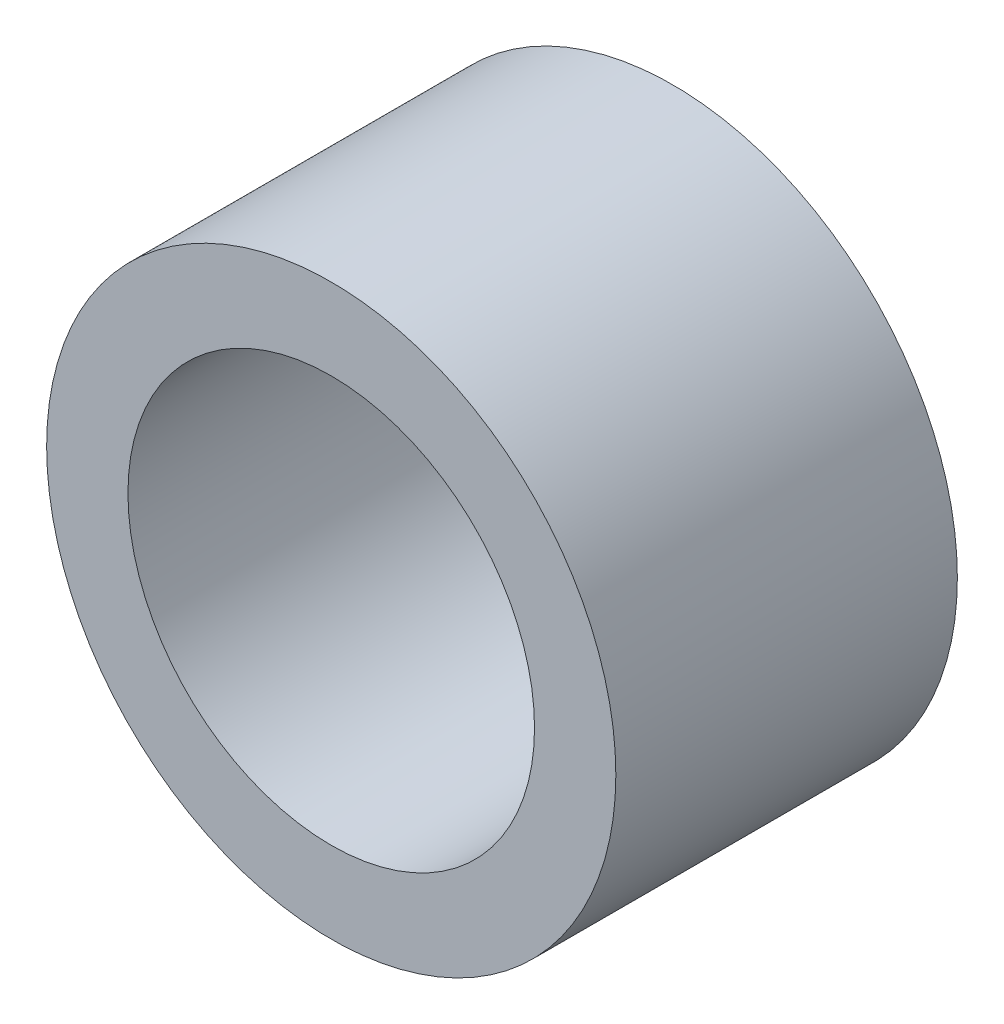
ISO-10303-21;
HEADER;
FILE_DESCRIPTION(('STEP AP214'),'2;1');
FILE_NAME('part.step','',(''),(''),'','','');
FILE_SCHEMA(('AUTOMOTIVE_DESIGN { 1 0 10303 214 1 1 1 1 }'));
ENDSEC;
DATA;
#1=APPLICATION_CONTEXT('core data for automotive mechanical design processes');
#2=APPLICATION_PROTOCOL_DEFINITION('international standard','automotive_design',2000,#1);
#3=PRODUCT_CONTEXT('',#1,'mechanical');
#4=PRODUCT('Part','Part','',(#3));
#5=PRODUCT_RELATED_PRODUCT_CATEGORY('part','',(#4));
#6=PRODUCT_DEFINITION_FORMATION('','',#4);
#7=PRODUCT_DEFINITION_CONTEXT('part definition',#1,'design');
#8=PRODUCT_DEFINITION('design','',#6,#7);
#9=PRODUCT_DEFINITION_SHAPE('','',#8);
#10=(LENGTH_UNIT() NAMED_UNIT(*) SI_UNIT(.MILLI.,.METRE.));
#11=(NAMED_UNIT(*) PLANE_ANGLE_UNIT() SI_UNIT($,.RADIAN.));
#12=(NAMED_UNIT(*) SI_UNIT($,.STERADIAN.) SOLID_ANGLE_UNIT());
#13=UNCERTAINTY_MEASURE_WITH_UNIT(LENGTH_MEASURE(1.E-05),#10,'distance_accuracy_value','');
#14=(GEOMETRIC_REPRESENTATION_CONTEXT(3) GLOBAL_UNCERTAINTY_ASSIGNED_CONTEXT((#13)) GLOBAL_UNIT_ASSIGNED_CONTEXT((#10,
#11,#12)) REPRESENTATION_CONTEXT('',''));
#15=CARTESIAN_POINT('',(0.,0.,0.));
#16=DIRECTION('',(0.,0.,1.));
#17=DIRECTION('',(1.,0.,0.));
#18=AXIS2_PLACEMENT_3D('',#15,#16,#17);
#19=CARTESIAN_POINT('',(0.,0.,21.));
#20=DIRECTION('',(0.,0.,1.));
#21=DIRECTION('',(1.,0.,0.));
#22=AXIS2_PLACEMENT_3D('',#19,#20,#21);
#23=PLANE('',#22);
#24=CARTESIAN_POINT('',(0.,0.,21.));
#25=DIRECTION('',(0.,0.,1.));
#26=DIRECTION('',(1.,0.,0.));
#27=AXIS2_PLACEMENT_3D('',#24,#25,#26);
#28=CIRCLE('',#27,17.5);
#29=CARTESIAN_POINT('',(-17.5,0.,21.));
#30=VERTEX_POINT('',#29);
#31=EDGE_CURVE('E10',#30,#30,#28,.T.);
#32=ORIENTED_EDGE('',*,*,#31,.T.);
#33=EDGE_LOOP('',(#32));
#34=FACE_BOUND('',#33,.T.);
#35=CARTESIAN_POINT('',(0.,0.,21.));
#36=DIRECTION('',(0.,0.,1.));
#37=DIRECTION('',(1.,0.,0.));
#38=AXIS2_PLACEMENT_3D('',#35,#36,#37);
#39=CIRCLE('',#38,12.5);
#40=CARTESIAN_POINT('',(-12.5,0.,21.));
#41=VERTEX_POINT('',#40);
#42=EDGE_CURVE('E56',#41,#41,#39,.T.);
#43=ORIENTED_EDGE('',*,*,#42,.F.);
#44=EDGE_LOOP('',(#43));
#45=FACE_BOUND('',#44,.T.);
#46=ADVANCED_FACE('F43',(#34,#45),#23,.T.);
#47=CARTESIAN_POINT('',(0.,0.,0.));
#48=DIRECTION('',(0.,0.,1.));
#49=DIRECTION('',(1.,0.,0.));
#50=AXIS2_PLACEMENT_3D('',#47,#48,#49);
#51=PLANE('',#50);
#52=CARTESIAN_POINT('',(0.,0.,0.));
#53=DIRECTION('',(0.,0.,1.));
#54=DIRECTION('',(1.,0.,0.));
#55=AXIS2_PLACEMENT_3D('',#52,#53,#54);
#56=CIRCLE('',#55,17.5);
#57=CARTESIAN_POINT('',(-17.5,0.,0.));
#58=VERTEX_POINT('',#57);
#59=EDGE_CURVE('E47',#58,#58,#56,.T.);
#60=ORIENTED_EDGE('',*,*,#59,.F.);
#61=EDGE_LOOP('',(#60));
#62=FACE_BOUND('',#61,.T.);
#63=CARTESIAN_POINT('',(0.,0.,0.));
#64=DIRECTION('',(0.,0.,1.));
#65=DIRECTION('',(1.,0.,0.));
#66=AXIS2_PLACEMENT_3D('',#63,#64,#65);
#67=CIRCLE('',#66,12.5);
#68=CARTESIAN_POINT('',(-12.5,0.,0.));
#69=VERTEX_POINT('',#68);
#70=EDGE_CURVE('E58',#69,#69,#67,.T.);
#71=ORIENTED_EDGE('',*,*,#70,.T.);
#72=EDGE_LOOP('',(#71));
#73=FACE_BOUND('',#72,.T.);
#74=ADVANCED_FACE('F70',(#62,#73),#51,.F.);
#75=CARTESIAN_POINT('',(0.,0.,21.));
#76=DIRECTION('',(0.,0.,-1.));
#77=DIRECTION('',(-1.,0.,0.));
#78=AXIS2_PLACEMENT_3D('',#75,#76,#77);
#79=CYLINDRICAL_SURFACE('',#78,17.5);
#80=CARTESIAN_POINT('',(-17.5,0.,21.));
#81=CARTESIAN_POINT('',(-17.5,0.,20.78125));
#82=CARTESIAN_POINT('',(-17.5,0.,20.5625));
#83=CARTESIAN_POINT('',(-17.5,0.,20.125));
#84=CARTESIAN_POINT('',(-17.5,0.,19.90625));
#85=CARTESIAN_POINT('',(-17.5,0.,19.46875));
#86=CARTESIAN_POINT('',(-17.5,0.,19.25));
#87=CARTESIAN_POINT('',(-17.5,0.,18.8125));
#88=CARTESIAN_POINT('',(-17.5,0.,18.59375));
#89=CARTESIAN_POINT('',(-17.5,0.,18.15625));
#90=CARTESIAN_POINT('',(-17.5,0.,17.9375));
#91=CARTESIAN_POINT('',(-17.5,0.,17.5));
#92=CARTESIAN_POINT('',(-17.5,0.,17.28125));
#93=CARTESIAN_POINT('',(-17.5,0.,16.84375));
#94=CARTESIAN_POINT('',(-17.5,0.,16.625));
#95=CARTESIAN_POINT('',(-17.5,0.,16.1875));
#96=CARTESIAN_POINT('',(-17.5,0.,15.96875));
#97=CARTESIAN_POINT('',(-17.5,0.,15.53125));
#98=CARTESIAN_POINT('',(-17.5,0.,15.3125));
#99=CARTESIAN_POINT('',(-17.5,0.,14.875));
#100=CARTESIAN_POINT('',(-17.5,0.,14.65625));
#101=CARTESIAN_POINT('',(-17.5,0.,14.21875));
#102=CARTESIAN_POINT('',(-17.5,0.,14.));
#103=CARTESIAN_POINT('',(-17.5,0.,13.5625));
#104=CARTESIAN_POINT('',(-17.5,0.,13.34375));
#105=CARTESIAN_POINT('',(-17.5,0.,12.90625));
#106=CARTESIAN_POINT('',(-17.5,0.,12.6875));
#107=CARTESIAN_POINT('',(-17.5,0.,12.25));
#108=CARTESIAN_POINT('',(-17.5,0.,12.03125));
#109=CARTESIAN_POINT('',(-17.5,0.,11.59375));
#110=CARTESIAN_POINT('',(-17.5,0.,11.375));
#111=CARTESIAN_POINT('',(-17.5,0.,10.9375));
#112=CARTESIAN_POINT('',(-17.5,0.,10.71875));
#113=CARTESIAN_POINT('',(-17.5,0.,10.28125));
#114=CARTESIAN_POINT('',(-17.5,0.,10.0625));
#115=CARTESIAN_POINT('',(-17.5,0.,9.625));
#116=CARTESIAN_POINT('',(-17.5,0.,9.40625));
#117=CARTESIAN_POINT('',(-17.5,0.,8.96875));
#118=CARTESIAN_POINT('',(-17.5,0.,8.75));
#119=CARTESIAN_POINT('',(-17.5,0.,8.3125));
#120=CARTESIAN_POINT('',(-17.5,0.,8.09375));
#121=CARTESIAN_POINT('',(-17.5,0.,7.65625));
#122=CARTESIAN_POINT('',(-17.5,0.,7.4375));
#123=CARTESIAN_POINT('',(-17.5,0.,7.));
#124=CARTESIAN_POINT('',(-17.5,0.,6.78125));
#125=CARTESIAN_POINT('',(-17.5,0.,6.34375));
#126=CARTESIAN_POINT('',(-17.5,0.,6.125));
#127=CARTESIAN_POINT('',(-17.5,0.,5.6875));
#128=CARTESIAN_POINT('',(-17.5,0.,5.46875));
#129=CARTESIAN_POINT('',(-17.5,0.,5.03125));
#130=CARTESIAN_POINT('',(-17.5,0.,4.8125));
#131=CARTESIAN_POINT('',(-17.5,0.,4.375));
#132=CARTESIAN_POINT('',(-17.5,0.,4.15625));
#133=CARTESIAN_POINT('',(-17.5,0.,3.71875));
#134=CARTESIAN_POINT('',(-17.5,0.,3.5));
#135=CARTESIAN_POINT('',(-17.5,0.,3.0625));
#136=CARTESIAN_POINT('',(-17.5,0.,2.84375));
#137=CARTESIAN_POINT('',(-17.5,0.,2.40625));
#138=CARTESIAN_POINT('',(-17.5,0.,2.1875));
#139=CARTESIAN_POINT('',(-17.5,0.,1.75));
#140=CARTESIAN_POINT('',(-17.5,0.,1.53125));
#141=CARTESIAN_POINT('',(-17.5,0.,1.09375));
#142=CARTESIAN_POINT('',(-17.5,0.,0.875000000000001));
#143=CARTESIAN_POINT('',(-17.5,0.,0.4375));
#144=CARTESIAN_POINT('',(-17.5,0.,0.21875));
#145=CARTESIAN_POINT('',(-17.5,0.,0.));
#146=B_SPLINE_CURVE_WITH_KNOTS('',3,(#80,#81,#82,#83,#84,#85,#86,#87,#88,#89,#90,#91,#92,#93,
#94,#95,#96,#97,#98,#99,#100,#101,#102,#103,#104,#105,#106,#107,#108,#109,#110,#111,#112,#113,
#114,#115,#116,#117,#118,#119,#120,#121,#122,#123,#124,#125,#126,#127,#128,#129,#130,#131,#132,
#133,#134,#135,#136,#137,#138,#139,#140,#141,#142,#143,#144,#145),.UNSPECIFIED.,.F.,.F.,(4,2,2,
2,2,2,2,2,2,2,2,2,2,2,2,2,2,2,2,2,2,2,2,2,2,2,2,2,2,2,2,2,4),(0.,0.656249999999997,1.3125,
1.96875,2.625,3.28125,3.9375,4.59375,5.25,5.90625,6.5625,7.21875,7.875,8.53125,9.1875,9.84375,
10.5,11.15625,11.8125,12.46875,13.125,13.78125,14.4375,15.09375,15.75,16.40625,17.0625,17.71875,
18.375,19.03125,19.6875,20.34375,21.),.UNSPECIFIED.);
#147=EDGE_CURVE('BSEAM45',#30,#58,#146,.T.);
#148=ORIENTED_EDGE('',*,*,#31,.F.);
#149=ORIENTED_EDGE('',*,*,#59,.T.);
#150=ORIENTED_EDGE('',*,*,#147,.T.);
#151=ORIENTED_EDGE('',*,*,#147,.F.);
#152=EDGE_LOOP('',(#148,#150,#149,#151));
#153=FACE_BOUND('',#152,.T.);
#154=ADVANCED_FACE('F45',(#153),#79,.T.);
#155=CARTESIAN_POINT('',(0.,0.,21.));
#156=DIRECTION('',(0.,0.,-1.));
#157=DIRECTION('',(-1.,0.,0.));
#158=AXIS2_PLACEMENT_3D('',#155,#156,#157);
#159=CYLINDRICAL_SURFACE('',#158,12.5);
#160=CARTESIAN_POINT('',(-12.5,0.,21.));
#161=CARTESIAN_POINT('',(-12.5,0.,20.78125));
#162=CARTESIAN_POINT('',(-12.5,0.,20.5625));
#163=CARTESIAN_POINT('',(-12.5,0.,20.125));
#164=CARTESIAN_POINT('',(-12.5,0.,19.90625));
#165=CARTESIAN_POINT('',(-12.5,0.,19.46875));
#166=CARTESIAN_POINT('',(-12.5,0.,19.25));
#167=CARTESIAN_POINT('',(-12.5,0.,18.8125));
#168=CARTESIAN_POINT('',(-12.5,0.,18.59375));
#169=CARTESIAN_POINT('',(-12.5,0.,18.15625));
#170=CARTESIAN_POINT('',(-12.5,0.,17.9375));
#171=CARTESIAN_POINT('',(-12.5,0.,17.5));
#172=CARTESIAN_POINT('',(-12.5,0.,17.28125));
#173=CARTESIAN_POINT('',(-12.5,0.,16.84375));
#174=CARTESIAN_POINT('',(-12.5,0.,16.625));
#175=CARTESIAN_POINT('',(-12.5,0.,16.1875));
#176=CARTESIAN_POINT('',(-12.5,0.,15.96875));
#177=CARTESIAN_POINT('',(-12.5,0.,15.53125));
#178=CARTESIAN_POINT('',(-12.5,0.,15.3125));
#179=CARTESIAN_POINT('',(-12.5,0.,14.875));
#180=CARTESIAN_POINT('',(-12.5,0.,14.65625));
#181=CARTESIAN_POINT('',(-12.5,0.,14.21875));
#182=CARTESIAN_POINT('',(-12.5,0.,14.));
#183=CARTESIAN_POINT('',(-12.5,0.,13.5625));
#184=CARTESIAN_POINT('',(-12.5,0.,13.34375));
#185=CARTESIAN_POINT('',(-12.5,0.,12.90625));
#186=CARTESIAN_POINT('',(-12.5,0.,12.6875));
#187=CARTESIAN_POINT('',(-12.5,0.,12.25));
#188=CARTESIAN_POINT('',(-12.5,0.,12.03125));
#189=CARTESIAN_POINT('',(-12.5,0.,11.59375));
#190=CARTESIAN_POINT('',(-12.5,0.,11.375));
#191=CARTESIAN_POINT('',(-12.5,0.,10.9375));
#192=CARTESIAN_POINT('',(-12.5,0.,10.71875));
#193=CARTESIAN_POINT('',(-12.5,0.,10.28125));
#194=CARTESIAN_POINT('',(-12.5,0.,10.0625));
#195=CARTESIAN_POINT('',(-12.5,0.,9.625));
#196=CARTESIAN_POINT('',(-12.5,0.,9.40625));
#197=CARTESIAN_POINT('',(-12.5,0.,8.96875));
#198=CARTESIAN_POINT('',(-12.5,0.,8.75));
#199=CARTESIAN_POINT('',(-12.5,0.,8.3125));
#200=CARTESIAN_POINT('',(-12.5,0.,8.09375));
#201=CARTESIAN_POINT('',(-12.5,0.,7.65625));
#202=CARTESIAN_POINT('',(-12.5,0.,7.4375));
#203=CARTESIAN_POINT('',(-12.5,0.,7.));
#204=CARTESIAN_POINT('',(-12.5,0.,6.78125));
#205=CARTESIAN_POINT('',(-12.5,0.,6.34375));
#206=CARTESIAN_POINT('',(-12.5,0.,6.125));
#207=CARTESIAN_POINT('',(-12.5,0.,5.6875));
#208=CARTESIAN_POINT('',(-12.5,0.,5.46875));
#209=CARTESIAN_POINT('',(-12.5,0.,5.03125));
#210=CARTESIAN_POINT('',(-12.5,0.,4.8125));
#211=CARTESIAN_POINT('',(-12.5,0.,4.375));
#212=CARTESIAN_POINT('',(-12.5,0.,4.15625));
#213=CARTESIAN_POINT('',(-12.5,0.,3.71875));
#214=CARTESIAN_POINT('',(-12.5,0.,3.5));
#215=CARTESIAN_POINT('',(-12.5,0.,3.0625));
#216=CARTESIAN_POINT('',(-12.5,0.,2.84375));
#217=CARTESIAN_POINT('',(-12.5,0.,2.40625));
#218=CARTESIAN_POINT('',(-12.5,0.,2.1875));
#219=CARTESIAN_POINT('',(-12.5,0.,1.75));
#220=CARTESIAN_POINT('',(-12.5,0.,1.53125));
#221=CARTESIAN_POINT('',(-12.5,0.,1.09375));
#222=CARTESIAN_POINT('',(-12.5,0.,0.875000000000001));
#223=CARTESIAN_POINT('',(-12.5,0.,0.4375));
#224=CARTESIAN_POINT('',(-12.5,0.,0.21875));
#225=CARTESIAN_POINT('',(-12.5,0.,0.));
#226=B_SPLINE_CURVE_WITH_KNOTS('',3,(#160,#161,#162,#163,#164,#165,#166,#167,#168,#169,#170,
#171,#172,#173,#174,#175,#176,#177,#178,#179,#180,#181,#182,#183,#184,#185,#186,#187,#188,#189,
#190,#191,#192,#193,#194,#195,#196,#197,#198,#199,#200,#201,#202,#203,#204,#205,#206,#207,#208,
#209,#210,#211,#212,#213,#214,#215,#216,#217,#218,#219,#220,#221,#222,#223,#224,#225),
.UNSPECIFIED.,.F.,.F.,(4,2,2,2,2,2,2,2,2,2,2,2,2,2,2,2,2,2,2,2,2,2,2,2,2,2,2,2,2,2,2,2,4),(0.,
0.656249999999997,1.3125,1.96875,2.625,3.28125,3.9375,4.59375,5.25,5.90625,6.5625,7.21875,7.875,
8.53125,9.1875,9.84375,10.5,11.15625,11.8125,12.46875,13.125,13.78125,14.4375,15.09375,15.75,
16.40625,17.0625,17.71875,18.375,19.03125,19.6875,20.34375,21.),.UNSPECIFIED.);
#227=EDGE_CURVE('BSEAM66',#41,#69,#226,.T.);
#228=ORIENTED_EDGE('',*,*,#42,.T.);
#229=ORIENTED_EDGE('',*,*,#70,.F.);
#230=ORIENTED_EDGE('',*,*,#227,.T.);
#231=ORIENTED_EDGE('',*,*,#227,.F.);
#232=EDGE_LOOP('',(#228,#230,#229,#231));
#233=FACE_BOUND('',#232,.T.);
#234=ADVANCED_FACE('F66',(#233),#159,.F.);
#235=CLOSED_SHELL('',(#46,#74,#154,#234));
#236=MANIFOLD_SOLID_BREP('B2',#235);
#237=ADVANCED_BREP_SHAPE_REPRESENTATION('',(#18,#236),#14);
#238=SHAPE_DEFINITION_REPRESENTATION(#9,#237);
ENDSEC;
END-ISO-10303-21;
